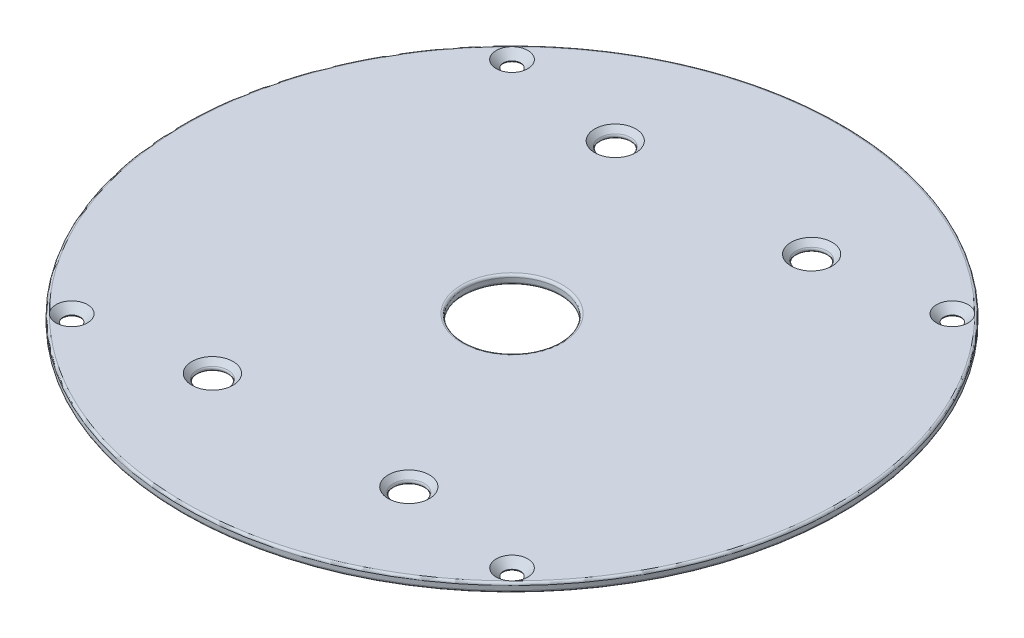
ISO-10303-21;
HEADER;
FILE_DESCRIPTION(('STEP AP214'),'2;1');
FILE_NAME('part.step','',(''),(''),'','','');
FILE_SCHEMA(('AUTOMOTIVE_DESIGN { 1 0 10303 214 1 1 1 1 }'));
ENDSEC;
DATA;
#1=APPLICATION_CONTEXT('core data for automotive mechanical design processes');
#2=APPLICATION_PROTOCOL_DEFINITION('international standard','automotive_design',2000,#1);
#3=PRODUCT_CONTEXT('',#1,'mechanical');
#4=PRODUCT('Part','Part','',(#3));
#5=PRODUCT_RELATED_PRODUCT_CATEGORY('part','',(#4));
#6=PRODUCT_DEFINITION_FORMATION('','',#4);
#7=PRODUCT_DEFINITION_CONTEXT('part definition',#1,'design');
#8=PRODUCT_DEFINITION('design','',#6,#7);
#9=PRODUCT_DEFINITION_SHAPE('','',#8);
#10=(LENGTH_UNIT() NAMED_UNIT(*) SI_UNIT(.MILLI.,.METRE.));
#11=(NAMED_UNIT(*) PLANE_ANGLE_UNIT() SI_UNIT($,.RADIAN.));
#12=(NAMED_UNIT(*) SI_UNIT($,.STERADIAN.) SOLID_ANGLE_UNIT());
#13=UNCERTAINTY_MEASURE_WITH_UNIT(LENGTH_MEASURE(1.E-05),#10,'distance_accuracy_value','');
#14=(GEOMETRIC_REPRESENTATION_CONTEXT(3) GLOBAL_UNCERTAINTY_ASSIGNED_CONTEXT((#13)) GLOBAL_UNIT_ASSIGNED_CONTEXT((#10,
#11,#12)) REPRESENTATION_CONTEXT('',''));
#15=CARTESIAN_POINT('',(0.,0.,0.));
#16=DIRECTION('',(0.,0.,1.));
#17=DIRECTION('',(1.,0.,0.));
#18=AXIS2_PLACEMENT_3D('',#15,#16,#17);
#19=CARTESIAN_POINT('',(0.,1.9,0.));
#20=DIRECTION('',(0.,-1.,0.));
#21=DIRECTION('',(0.,0.,-1.));
#22=AXIS2_PLACEMENT_3D('',#19,#20,#21);
#23=CYLINDRICAL_SURFACE('',#22,10.);
#24=CARTESIAN_POINT('',(0.,0.5,0.));
#25=DIRECTION('',(0.,1.,0.));
#26=DIRECTION('',(0.,0.,1.));
#27=AXIS2_PLACEMENT_3D('',#24,#25,#26);
#28=CIRCLE('',#27,10.);
#29=CARTESIAN_POINT('',(0.,0.5,-10.));
#30=VERTEX_POINT('',#29);
#31=EDGE_CURVE('E78',#30,#30,#28,.F.);
#32=CARTESIAN_POINT('',(0.,1.4,0.));
#33=DIRECTION('',(0.,1.,0.));
#34=DIRECTION('',(0.,0.,1.));
#35=AXIS2_PLACEMENT_3D('',#32,#33,#34);
#36=CIRCLE('',#35,10.);
#37=CARTESIAN_POINT('',(0.,1.4,-10.));
#38=VERTEX_POINT('',#37);
#39=EDGE_CURVE('E83',#38,#38,#36,.T.);
#40=CARTESIAN_POINT('',(0.,0.5,-10.));
#41=CARTESIAN_POINT('',(0.,0.509375,-10.));
#42=CARTESIAN_POINT('',(0.,0.51875,-10.));
#43=CARTESIAN_POINT('',(0.,0.5375,-10.));
#44=CARTESIAN_POINT('',(0.,0.546875,-10.));
#45=CARTESIAN_POINT('',(0.,0.565625,-10.));
#46=CARTESIAN_POINT('',(0.,0.575,-10.));
#47=CARTESIAN_POINT('',(0.,0.59375,-10.));
#48=CARTESIAN_POINT('',(0.,0.603125,-10.));
#49=CARTESIAN_POINT('',(0.,0.621875,-10.));
#50=CARTESIAN_POINT('',(0.,0.63125,-10.));
#51=CARTESIAN_POINT('',(0.,0.65,-10.));
#52=CARTESIAN_POINT('',(0.,0.659375,-10.));
#53=CARTESIAN_POINT('',(0.,0.678125,-10.));
#54=CARTESIAN_POINT('',(0.,0.6875,-10.));
#55=CARTESIAN_POINT('',(0.,0.70625,-10.));
#56=CARTESIAN_POINT('',(0.,0.715625,-10.));
#57=CARTESIAN_POINT('',(0.,0.734375,-10.));
#58=CARTESIAN_POINT('',(0.,0.74375,-10.));
#59=CARTESIAN_POINT('',(0.,0.7625,-10.));
#60=CARTESIAN_POINT('',(0.,0.771875,-10.));
#61=CARTESIAN_POINT('',(0.,0.790625,-10.));
#62=CARTESIAN_POINT('',(0.,0.8,-10.));
#63=CARTESIAN_POINT('',(0.,0.81875,-10.));
#64=CARTESIAN_POINT('',(0.,0.828125,-10.));
#65=CARTESIAN_POINT('',(0.,0.846875,-10.));
#66=CARTESIAN_POINT('',(0.,0.85625,-10.));
#67=CARTESIAN_POINT('',(0.,0.875,-10.));
#68=CARTESIAN_POINT('',(0.,0.884375,-10.));
#69=CARTESIAN_POINT('',(0.,0.903125,-10.));
#70=CARTESIAN_POINT('',(0.,0.9125,-10.));
#71=CARTESIAN_POINT('',(0.,0.93125,-10.));
#72=CARTESIAN_POINT('',(0.,0.940625,-10.));
#73=CARTESIAN_POINT('',(0.,0.959375,-10.));
#74=CARTESIAN_POINT('',(0.,0.96875,-10.));
#75=CARTESIAN_POINT('',(0.,0.9875,-10.));
#76=CARTESIAN_POINT('',(0.,0.996875,-10.));
#77=CARTESIAN_POINT('',(0.,1.015625,-10.));
#78=CARTESIAN_POINT('',(0.,1.025,-10.));
#79=CARTESIAN_POINT('',(0.,1.04375,-10.));
#80=CARTESIAN_POINT('',(0.,1.053125,-10.));
#81=CARTESIAN_POINT('',(0.,1.071875,-10.));
#82=CARTESIAN_POINT('',(0.,1.08125,-10.));
#83=CARTESIAN_POINT('',(0.,1.1,-10.));
#84=CARTESIAN_POINT('',(0.,1.109375,-10.));
#85=CARTESIAN_POINT('',(0.,1.128125,-10.));
#86=CARTESIAN_POINT('',(0.,1.1375,-10.));
#87=CARTESIAN_POINT('',(0.,1.15625,-10.));
#88=CARTESIAN_POINT('',(0.,1.165625,-10.));
#89=CARTESIAN_POINT('',(0.,1.184375,-10.));
#90=CARTESIAN_POINT('',(0.,1.19375,-10.));
#91=CARTESIAN_POINT('',(0.,1.2125,-10.));
#92=CARTESIAN_POINT('',(0.,1.221875,-10.));
#93=CARTESIAN_POINT('',(0.,1.240625,-10.));
#94=CARTESIAN_POINT('',(0.,1.25,-10.));
#95=CARTESIAN_POINT('',(0.,1.26875,-10.));
#96=CARTESIAN_POINT('',(0.,1.278125,-10.));
#97=CARTESIAN_POINT('',(0.,1.296875,-10.));
#98=CARTESIAN_POINT('',(0.,1.30625,-10.));
#99=CARTESIAN_POINT('',(0.,1.325,-10.));
#100=CARTESIAN_POINT('',(0.,1.334375,-10.));
#101=CARTESIAN_POINT('',(0.,1.353125,-10.));
#102=CARTESIAN_POINT('',(0.,1.3625,-10.));
#103=CARTESIAN_POINT('',(0.,1.38125,-10.));
#104=CARTESIAN_POINT('',(0.,1.390625,-10.));
#105=CARTESIAN_POINT('',(0.,1.4,-10.));
#106=B_SPLINE_CURVE_WITH_KNOTS('',3,(#40,#41,#42,#43,#44,#45,#46,#47,#48,#49,#50,#51,#52,#53,
#54,#55,#56,#57,#58,#59,#60,#61,#62,#63,#64,#65,#66,#67,#68,#69,#70,#71,#72,#73,#74,#75,#76,#77,
#78,#79,#80,#81,#82,#83,#84,#85,#86,#87,#88,#89,#90,#91,#92,#93,#94,#95,#96,#97,#98,#99,#100,
#101,#102,#103,#104,#105),.UNSPECIFIED.,.F.,.F.,(4,2,2,2,2,2,2,2,2,2,2,2,2,2,2,2,2,2,2,2,2,2,2,
2,2,2,2,2,2,2,2,2,4),(0.,0.0281249999999999,0.0562500000000001,0.084375,0.1125,0.140625,0.16875,
0.196875,0.225,0.253125,0.28125,0.309375,0.3375,0.365625,0.39375,0.421875,0.45,0.478125,0.50625,
0.534375,0.5625,0.590625,0.61875,0.646875,0.675,0.703125,0.73125,0.759375,0.7875,0.815625,
0.84375,0.871875,0.9),.UNSPECIFIED.);
#107=EDGE_CURVE('BSEAM43',#30,#38,#106,.T.);
#108=ORIENTED_EDGE('',*,*,#31,.T.);
#109=ORIENTED_EDGE('',*,*,#39,.T.);
#110=ORIENTED_EDGE('',*,*,#107,.T.);
#111=ORIENTED_EDGE('',*,*,#107,.F.);
#112=EDGE_LOOP('',(#108,#110,#109,#111));
#113=FACE_BOUND('',#112,.T.);
#114=ADVANCED_FACE('F43',(#113),#23,.F.);
#115=CARTESIAN_POINT('',(0.,1.9,0.));
#116=DIRECTION('',(0.,-1.,0.));
#117=DIRECTION('',(0.,0.,-1.));
#118=AXIS2_PLACEMENT_3D('',#115,#116,#117);
#119=CYLINDRICAL_SURFACE('',#118,68.8);
#120=CARTESIAN_POINT('',(0.,0.5,0.));
#121=DIRECTION('',(0.,1.,0.));
#122=DIRECTION('',(0.,0.,1.));
#123=AXIS2_PLACEMENT_3D('',#120,#121,#122);
#124=CIRCLE('',#123,68.8);
#125=CARTESIAN_POINT('',(0.,0.5,-68.8));
#126=VERTEX_POINT('',#125);
#127=EDGE_CURVE('E11',#126,#126,#124,.T.);
#128=CARTESIAN_POINT('',(0.,1.4,0.));
#129=DIRECTION('',(0.,1.,0.));
#130=DIRECTION('',(0.,0.,1.));
#131=AXIS2_PLACEMENT_3D('',#128,#129,#130);
#132=CIRCLE('',#131,68.8);
#133=CARTESIAN_POINT('',(0.,1.4,-68.8));
#134=VERTEX_POINT('',#133);
#135=EDGE_CURVE('E51',#134,#134,#132,.F.);
#136=CARTESIAN_POINT('',(0.,0.5,-68.8));
#137=CARTESIAN_POINT('',(0.,0.509375,-68.8));
#138=CARTESIAN_POINT('',(0.,0.51875,-68.8));
#139=CARTESIAN_POINT('',(0.,0.5375,-68.8));
#140=CARTESIAN_POINT('',(0.,0.546875,-68.8));
#141=CARTESIAN_POINT('',(0.,0.565625,-68.8));
#142=CARTESIAN_POINT('',(0.,0.575,-68.8));
#143=CARTESIAN_POINT('',(0.,0.59375,-68.8));
#144=CARTESIAN_POINT('',(0.,0.603125,-68.8));
#145=CARTESIAN_POINT('',(0.,0.621875,-68.8));
#146=CARTESIAN_POINT('',(0.,0.63125,-68.8));
#147=CARTESIAN_POINT('',(0.,0.65,-68.8));
#148=CARTESIAN_POINT('',(0.,0.659375,-68.8));
#149=CARTESIAN_POINT('',(0.,0.678125,-68.8));
#150=CARTESIAN_POINT('',(0.,0.6875,-68.8));
#151=CARTESIAN_POINT('',(0.,0.70625,-68.8));
#152=CARTESIAN_POINT('',(0.,0.715625,-68.8));
#153=CARTESIAN_POINT('',(0.,0.734375,-68.8));
#154=CARTESIAN_POINT('',(0.,0.74375,-68.8));
#155=CARTESIAN_POINT('',(0.,0.7625,-68.8));
#156=CARTESIAN_POINT('',(0.,0.771875,-68.8));
#157=CARTESIAN_POINT('',(0.,0.790625,-68.8));
#158=CARTESIAN_POINT('',(0.,0.8,-68.8));
#159=CARTESIAN_POINT('',(0.,0.81875,-68.8));
#160=CARTESIAN_POINT('',(0.,0.828125,-68.8));
#161=CARTESIAN_POINT('',(0.,0.846875,-68.8));
#162=CARTESIAN_POINT('',(0.,0.85625,-68.8));
#163=CARTESIAN_POINT('',(0.,0.875,-68.8));
#164=CARTESIAN_POINT('',(0.,0.884375,-68.8));
#165=CARTESIAN_POINT('',(0.,0.903125,-68.8));
#166=CARTESIAN_POINT('',(0.,0.9125,-68.8));
#167=CARTESIAN_POINT('',(0.,0.93125,-68.8));
#168=CARTESIAN_POINT('',(0.,0.940625,-68.8));
#169=CARTESIAN_POINT('',(0.,0.959375,-68.8));
#170=CARTESIAN_POINT('',(0.,0.96875,-68.8));
#171=CARTESIAN_POINT('',(0.,0.9875,-68.8));
#172=CARTESIAN_POINT('',(0.,0.996875,-68.8));
#173=CARTESIAN_POINT('',(0.,1.015625,-68.8));
#174=CARTESIAN_POINT('',(0.,1.025,-68.8));
#175=CARTESIAN_POINT('',(0.,1.04375,-68.8));
#176=CARTESIAN_POINT('',(0.,1.053125,-68.8));
#177=CARTESIAN_POINT('',(0.,1.071875,-68.8));
#178=CARTESIAN_POINT('',(0.,1.08125,-68.8));
#179=CARTESIAN_POINT('',(0.,1.1,-68.8));
#180=CARTESIAN_POINT('',(0.,1.109375,-68.8));
#181=CARTESIAN_POINT('',(0.,1.128125,-68.8));
#182=CARTESIAN_POINT('',(0.,1.1375,-68.8));
#183=CARTESIAN_POINT('',(0.,1.15625,-68.8));
#184=CARTESIAN_POINT('',(0.,1.165625,-68.8));
#185=CARTESIAN_POINT('',(0.,1.184375,-68.8));
#186=CARTESIAN_POINT('',(0.,1.19375,-68.8));
#187=CARTESIAN_POINT('',(0.,1.2125,-68.8));
#188=CARTESIAN_POINT('',(0.,1.221875,-68.8));
#189=CARTESIAN_POINT('',(0.,1.240625,-68.8));
#190=CARTESIAN_POINT('',(0.,1.25,-68.8));
#191=CARTESIAN_POINT('',(0.,1.26875,-68.8));
#192=CARTESIAN_POINT('',(0.,1.278125,-68.8));
#193=CARTESIAN_POINT('',(0.,1.296875,-68.8));
#194=CARTESIAN_POINT('',(0.,1.30625,-68.8));
#195=CARTESIAN_POINT('',(0.,1.325,-68.8));
#196=CARTESIAN_POINT('',(0.,1.334375,-68.8));
#197=CARTESIAN_POINT('',(0.,1.353125,-68.8));
#198=CARTESIAN_POINT('',(0.,1.3625,-68.8));
#199=CARTESIAN_POINT('',(0.,1.38125,-68.8));
#200=CARTESIAN_POINT('',(0.,1.390625,-68.8));
#201=CARTESIAN_POINT('',(0.,1.4,-68.8));
#202=B_SPLINE_CURVE_WITH_KNOTS('',3,(#136,#137,#138,#139,#140,#141,#142,#143,#144,#145,#146,
#147,#148,#149,#150,#151,#152,#153,#154,#155,#156,#157,#158,#159,#160,#161,#162,#163,#164,#165,
#166,#167,#168,#169,#170,#171,#172,#173,#174,#175,#176,#177,#178,#179,#180,#181,#182,#183,#184,
#185,#186,#187,#188,#189,#190,#191,#192,#193,#194,#195,#196,#197,#198,#199,#200,#201),
.UNSPECIFIED.,.F.,.F.,(4,2,2,2,2,2,2,2,2,2,2,2,2,2,2,2,2,2,2,2,2,2,2,2,2,2,2,2,2,2,2,2,4),(0.,
0.0281249999999999,0.0562500000000001,0.084375,0.1125,0.140625,0.16875,0.196875,0.225,0.253125,
0.28125,0.309375,0.3375,0.365625,0.39375,0.421875,0.45,0.478125,0.50625,0.534375,0.5625,
0.590625,0.61875,0.646875,0.675,0.703125,0.73125,0.759375,0.7875,0.815625,0.84375,0.871875,0.9),.UNSPECIFIED.);
#203=EDGE_CURVE('BSEAM98',#126,#134,#202,.T.);
#204=ORIENTED_EDGE('',*,*,#127,.T.);
#205=ORIENTED_EDGE('',*,*,#135,.T.);
#206=ORIENTED_EDGE('',*,*,#203,.T.);
#207=ORIENTED_EDGE('',*,*,#203,.F.);
#208=EDGE_LOOP('',(#204,#206,#205,#207));
#209=FACE_BOUND('',#208,.T.);
#210=ADVANCED_FACE('F98',(#209),#119,.T.);
#211=CARTESIAN_POINT('',(0.,1.9,0.));
#212=DIRECTION('',(0.,1.,0.));
#213=DIRECTION('',(0.,0.,1.));
#214=AXIS2_PLACEMENT_3D('',#211,#212,#213);
#215=PLANE('',#214);
#216=CARTESIAN_POINT('',(0.,1.9,0.));
#217=DIRECTION('',(0.,1.,0.));
#218=DIRECTION('',(0.,0.,1.));
#219=AXIS2_PLACEMENT_3D('',#216,#217,#218);
#220=CIRCLE('',#219,10.5);
#221=CARTESIAN_POINT('',(0.,1.9,10.5));
#222=VERTEX_POINT('',#221);
#223=EDGE_CURVE('E92',#222,#222,#220,.F.);
#224=ORIENTED_EDGE('',*,*,#223,.T.);
#225=EDGE_LOOP('',(#224));
#226=FACE_BOUND('',#225,.T.);
#227=CARTESIAN_POINT('',(45.9619407771258,1.9,45.9619407771253));
#228=DIRECTION('',(0.,1.,0.));
#229=DIRECTION('',(0.,0.,1.));
#230=AXIS2_PLACEMENT_3D('',#227,#228,#229);
#231=CIRCLE('',#230,3.30000000000008);
#232=CARTESIAN_POINT('',(48.2953931550415,1.9,48.295393155041));
#233=VERTEX_POINT('',#232);
#234=EDGE_CURVE('E77',#233,#233,#231,.F.);
#235=ORIENTED_EDGE('',*,*,#234,.T.);
#236=CARTESIAN_POINT('',(0.,1.9,0.));
#237=DIRECTION('',(0.,1.,0.));
#238=DIRECTION('',(0.,0.,1.));
#239=AXIS2_PLACEMENT_3D('',#236,#237,#238);
#240=CIRCLE('',#239,68.3);
#241=CARTESIAN_POINT('',(48.295393155041,1.9,-48.2953931550415));
#242=VERTEX_POINT('',#241);
#243=EDGE_CURVE('E89',#233,#242,#240,.T.);
#244=ORIENTED_EDGE('',*,*,#243,.T.);
#245=CARTESIAN_POINT('',(45.9619407771253,1.9,-45.9619407771258));
#246=DIRECTION('',(0.,1.,0.));
#247=DIRECTION('',(0.,0.,1.));
#248=AXIS2_PLACEMENT_3D('',#245,#246,#247);
#249=CIRCLE('',#248,3.30000000000008);
#250=EDGE_CURVE('E271',#242,#242,#249,.F.);
#251=ORIENTED_EDGE('',*,*,#250,.T.);
#252=CARTESIAN_POINT('',(0.,1.9,0.));
#253=DIRECTION('',(0.,1.,0.));
#254=DIRECTION('',(0.,0.,1.));
#255=AXIS2_PLACEMENT_3D('',#252,#253,#254);
#256=CIRCLE('',#255,68.3);
#257=CARTESIAN_POINT('',(-48.2953931550415,1.9,-48.295393155041));
#258=VERTEX_POINT('',#257);
#259=EDGE_CURVE('E59',#242,#258,#256,.T.);
#260=ORIENTED_EDGE('',*,*,#259,.T.);
#261=CARTESIAN_POINT('',(-45.9619407771258,1.9,-45.9619407771253));
#262=DIRECTION('',(0.,1.,0.));
#263=DIRECTION('',(0.,0.,1.));
#264=AXIS2_PLACEMENT_3D('',#261,#262,#263);
#265=CIRCLE('',#264,3.30000000000008);
#266=EDGE_CURVE('E272',#258,#258,#265,.F.);
#267=ORIENTED_EDGE('',*,*,#266,.T.);
#268=CARTESIAN_POINT('',(0.,1.9,0.));
#269=DIRECTION('',(0.,1.,0.));
#270=DIRECTION('',(0.,0.,1.));
#271=AXIS2_PLACEMENT_3D('',#268,#269,#270);
#272=CIRCLE('',#271,68.3);
#273=CARTESIAN_POINT('',(-48.295393155041,1.9,48.2953931550415));
#274=VERTEX_POINT('',#273);
#275=EDGE_CURVE('E79',#258,#274,#272,.T.);
#276=ORIENTED_EDGE('',*,*,#275,.T.);
#277=CARTESIAN_POINT('',(-45.9619407771254,1.9,45.9619407771258));
#278=DIRECTION('',(0.,1.,0.));
#279=DIRECTION('',(0.,0.,1.));
#280=AXIS2_PLACEMENT_3D('',#277,#278,#279);
#281=CIRCLE('',#280,3.30000000000008);
#282=EDGE_CURVE('E76',#274,#274,#281,.F.);
#283=ORIENTED_EDGE('',*,*,#282,.T.);
#284=CARTESIAN_POINT('',(0.,1.9,0.));
#285=DIRECTION('',(0.,1.,0.));
#286=DIRECTION('',(0.,0.,1.));
#287=AXIS2_PLACEMENT_3D('',#284,#285,#286);
#288=CIRCLE('',#287,68.3);
#289=EDGE_CURVE('E75',#274,#233,#288,.T.);
#290=ORIENTED_EDGE('',*,*,#289,.T.);
#291=EDGE_LOOP('',(#235,#244,#251,#260,#267,#276,#283,#290));
#292=FACE_BOUND('',#291,.T.);
#293=CARTESIAN_POINT('',(-20.5,1.9,-42.05));
#294=DIRECTION('',(0.,1.,0.));
#295=DIRECTION('',(0.,0.,1.));
#296=AXIS2_PLACEMENT_3D('',#293,#294,#295);
#297=CIRCLE('',#296,4.30000000000002);
#298=CARTESIAN_POINT('',(-20.5,1.9,-37.75));
#299=VERTEX_POINT('',#298);
#300=EDGE_CURVE('E277',#299,#299,#297,.F.);
#301=ORIENTED_EDGE('',*,*,#300,.T.);
#302=EDGE_LOOP('',(#301));
#303=FACE_BOUND('',#302,.T.);
#304=CARTESIAN_POINT('',(20.5,1.9,-42.05));
#305=DIRECTION('',(0.,1.,0.));
#306=DIRECTION('',(0.,0.,1.));
#307=AXIS2_PLACEMENT_3D('',#304,#305,#306);
#308=CIRCLE('',#307,4.30000000000002);
#309=CARTESIAN_POINT('',(20.5,1.9,-37.75));
#310=VERTEX_POINT('',#309);
#311=EDGE_CURVE('E282',#310,#310,#308,.F.);
#312=ORIENTED_EDGE('',*,*,#311,.T.);
#313=EDGE_LOOP('',(#312));
#314=FACE_BOUND('',#313,.T.);
#315=CARTESIAN_POINT('',(20.5,1.9,42.05));
#316=DIRECTION('',(0.,1.,0.));
#317=DIRECTION('',(0.,0.,1.));
#318=AXIS2_PLACEMENT_3D('',#315,#316,#317);
#319=CIRCLE('',#318,4.30000000000002);
#320=CARTESIAN_POINT('',(20.5,1.9,46.35));
#321=VERTEX_POINT('',#320);
#322=EDGE_CURVE('E284',#321,#321,#319,.F.);
#323=ORIENTED_EDGE('',*,*,#322,.T.);
#324=EDGE_LOOP('',(#323));
#325=FACE_BOUND('',#324,.T.);
#326=CARTESIAN_POINT('',(-20.5,1.9,42.05));
#327=DIRECTION('',(0.,1.,0.));
#328=DIRECTION('',(0.,0.,1.));
#329=AXIS2_PLACEMENT_3D('',#326,#327,#328);
#330=CIRCLE('',#329,4.30000000000002);
#331=CARTESIAN_POINT('',(-20.5,1.9,46.35));
#332=VERTEX_POINT('',#331);
#333=EDGE_CURVE('E290',#332,#332,#330,.F.);
#334=ORIENTED_EDGE('',*,*,#333,.T.);
#335=EDGE_LOOP('',(#334));
#336=FACE_BOUND('',#335,.T.);
#337=ADVANCED_FACE('F74',(#226,#292,#303,#314,#325,#336),#215,.T.);
#338=CARTESIAN_POINT('',(0.,0.,0.));
#339=DIRECTION('',(0.,1.,0.));
#340=DIRECTION('',(0.,0.,1.));
#341=AXIS2_PLACEMENT_3D('',#338,#339,#340);
#342=PLANE('',#341);
#343=CARTESIAN_POINT('',(-45.9619407771258,0.,-45.9619407771253));
#344=DIRECTION('',(0.,1.,0.));
#345=DIRECTION('',(0.,0.,1.));
#346=AXIS2_PLACEMENT_3D('',#343,#344,#345);
#347=CIRCLE('',#346,2.28989794855662);
#348=CARTESIAN_POINT('',(-45.9619407771258,0.,-43.6720428285687));
#349=VERTEX_POINT('',#348);
#350=EDGE_CURVE('E229',#349,#349,#347,.T.);
#351=ORIENTED_EDGE('',*,*,#350,.T.);
#352=EDGE_LOOP('',(#351));
#353=FACE_BOUND('',#352,.T.);
#354=CARTESIAN_POINT('',(45.9619407771253,0.,-45.9619407771258));
#355=DIRECTION('',(0.,1.,0.));
#356=DIRECTION('',(0.,0.,1.));
#357=AXIS2_PLACEMENT_3D('',#354,#355,#356);
#358=CIRCLE('',#357,2.2898979485566);
#359=CARTESIAN_POINT('',(45.9619407771253,0.,-43.6720428285692));
#360=VERTEX_POINT('',#359);
#361=EDGE_CURVE('E231',#360,#360,#358,.T.);
#362=ORIENTED_EDGE('',*,*,#361,.T.);
#363=EDGE_LOOP('',(#362));
#364=FACE_BOUND('',#363,.T.);
#365=CARTESIAN_POINT('',(45.9619407771258,0.,45.9619407771253));
#366=DIRECTION('',(0.,1.,0.));
#367=DIRECTION('',(0.,0.,1.));
#368=AXIS2_PLACEMENT_3D('',#365,#366,#367);
#369=CIRCLE('',#368,2.28989794855662);
#370=CARTESIAN_POINT('',(45.9619407771258,0.,48.251838725682));
#371=VERTEX_POINT('',#370);
#372=EDGE_CURVE('E236',#371,#371,#369,.T.);
#373=ORIENTED_EDGE('',*,*,#372,.T.);
#374=EDGE_LOOP('',(#373));
#375=FACE_BOUND('',#374,.T.);
#376=CARTESIAN_POINT('',(-45.9619407771254,0.,45.9619407771258));
#377=DIRECTION('',(0.,1.,0.));
#378=DIRECTION('',(0.,0.,1.));
#379=AXIS2_PLACEMENT_3D('',#376,#377,#378);
#380=CIRCLE('',#379,2.28989794855662);
#381=CARTESIAN_POINT('',(-45.9619407771254,0.,48.2518387256824));
#382=VERTEX_POINT('',#381);
#383=EDGE_CURVE('E237',#382,#382,#380,.T.);
#384=ORIENTED_EDGE('',*,*,#383,.T.);
#385=EDGE_LOOP('',(#384));
#386=FACE_BOUND('',#385,.T.);
#387=CARTESIAN_POINT('',(-20.5,0.,42.05));
#388=DIRECTION('',(0.,1.,0.));
#389=DIRECTION('',(0.,0.,1.));
#390=AXIS2_PLACEMENT_3D('',#387,#388,#389);
#391=CIRCLE('',#390,3.60710678118658);
#392=CARTESIAN_POINT('',(-20.5,0.,45.6571067811866));
#393=VERTEX_POINT('',#392);
#394=EDGE_CURVE('E245',#393,#393,#391,.T.);
#395=ORIENTED_EDGE('',*,*,#394,.T.);
#396=EDGE_LOOP('',(#395));
#397=FACE_BOUND('',#396,.T.);
#398=CARTESIAN_POINT('',(20.5,0.,42.05));
#399=DIRECTION('',(0.,1.,0.));
#400=DIRECTION('',(0.,0.,1.));
#401=AXIS2_PLACEMENT_3D('',#398,#399,#400);
#402=CIRCLE('',#401,3.60710678118658);
#403=CARTESIAN_POINT('',(20.5,0.,45.6571067811866));
#404=VERTEX_POINT('',#403);
#405=EDGE_CURVE('E244',#404,#404,#402,.T.);
#406=ORIENTED_EDGE('',*,*,#405,.T.);
#407=EDGE_LOOP('',(#406));
#408=FACE_BOUND('',#407,.T.);
#409=CARTESIAN_POINT('',(20.5,0.,-42.05));
#410=DIRECTION('',(0.,1.,0.));
#411=DIRECTION('',(0.,0.,1.));
#412=AXIS2_PLACEMENT_3D('',#409,#410,#411);
#413=CIRCLE('',#412,3.60710678118658);
#414=CARTESIAN_POINT('',(20.5,0.,-38.4428932188134));
#415=VERTEX_POINT('',#414);
#416=EDGE_CURVE('E247',#415,#415,#413,.T.);
#417=ORIENTED_EDGE('',*,*,#416,.T.);
#418=EDGE_LOOP('',(#417));
#419=FACE_BOUND('',#418,.T.);
#420=CARTESIAN_POINT('',(-20.5,0.,-42.05));
#421=DIRECTION('',(0.,1.,0.));
#422=DIRECTION('',(0.,0.,1.));
#423=AXIS2_PLACEMENT_3D('',#420,#421,#422);
#424=CIRCLE('',#423,3.60710678118658);
#425=CARTESIAN_POINT('',(-20.5,0.,-38.4428932188134));
#426=VERTEX_POINT('',#425);
#427=EDGE_CURVE('E252',#426,#426,#424,.T.);
#428=ORIENTED_EDGE('',*,*,#427,.T.);
#429=EDGE_LOOP('',(#428));
#430=FACE_BOUND('',#429,.T.);
#431=CARTESIAN_POINT('',(0.,0.,0.));
#432=DIRECTION('',(0.,1.,0.));
#433=DIRECTION('',(0.,0.,1.));
#434=AXIS2_PLACEMENT_3D('',#431,#432,#433);
#435=CIRCLE('',#434,10.5);
#436=CARTESIAN_POINT('',(0.,0.,10.5));
#437=VERTEX_POINT('',#436);
#438=EDGE_CURVE('E251',#437,#437,#435,.T.);
#439=ORIENTED_EDGE('',*,*,#438,.T.);
#440=EDGE_LOOP('',(#439));
#441=FACE_BOUND('',#440,.T.);
#442=CARTESIAN_POINT('',(0.,0.,0.));
#443=DIRECTION('',(0.,1.,0.));
#444=DIRECTION('',(0.,0.,1.));
#445=AXIS2_PLACEMENT_3D('',#442,#443,#444);
#446=CIRCLE('',#445,68.3);
#447=CARTESIAN_POINT('',(0.,0.,68.3));
#448=VERTEX_POINT('',#447);
#449=EDGE_CURVE('E260',#448,#448,#446,.F.);
#450=ORIENTED_EDGE('',*,*,#449,.T.);
#451=EDGE_LOOP('',(#450));
#452=FACE_BOUND('',#451,.T.);
#453=ADVANCED_FACE('F121',(#353,#364,#375,#386,#397,#408,#419,#430,#441,#452),#342,.F.);
#454=CARTESIAN_POINT('',(-20.5,-0.100000000000035,-42.05));
#455=DIRECTION('',(0.,1.,0.));
#456=DIRECTION('',(0.,0.,1.));
#457=AXIS2_PLACEMENT_3D('',#454,#455,#456);
#458=CONICAL_SURFACE('',#457,2.3,0.785398163397444);
#459=CARTESIAN_POINT('',(-20.5,0.853553390593272,-42.05));
#460=DIRECTION('',(0.,1.,0.));
#461=DIRECTION('',(0.,0.,1.));
#462=AXIS2_PLACEMENT_3D('',#459,#460,#461);
#463=CIRCLE('',#462,3.2535533905933);
#464=CARTESIAN_POINT('',(-20.5,0.853553390593272,-38.7964466094067));
#465=VERTEX_POINT('',#464);
#466=EDGE_CURVE('E220',#465,#465,#463,.F.);
#467=ORIENTED_EDGE('',*,*,#466,.T.);
#468=EDGE_LOOP('',(#467));
#469=FACE_BOUND('',#468,.T.);
#470=ORIENTED_EDGE('',*,*,#300,.F.);
#471=EDGE_LOOP('',(#470));
#472=FACE_BOUND('',#471,.T.);
#473=ADVANCED_FACE('F120',(#469,#472),#458,.F.);
#474=CARTESIAN_POINT('',(20.5,-0.100000000000035,-42.05));
#475=DIRECTION('',(0.,1.,0.));
#476=DIRECTION('',(0.,0.,1.));
#477=AXIS2_PLACEMENT_3D('',#474,#475,#476);
#478=CONICAL_SURFACE('',#477,2.3,0.785398163397444);
#479=CARTESIAN_POINT('',(20.5,0.853553390593272,-42.05));
#480=DIRECTION('',(0.,1.,0.));
#481=DIRECTION('',(0.,0.,1.));
#482=AXIS2_PLACEMENT_3D('',#479,#480,#481);
#483=CIRCLE('',#482,3.2535533905933);
#484=CARTESIAN_POINT('',(20.5,0.853553390593272,-38.7964466094067));
#485=VERTEX_POINT('',#484);
#486=EDGE_CURVE('E219',#485,#485,#483,.F.);
#487=ORIENTED_EDGE('',*,*,#486,.T.);
#488=EDGE_LOOP('',(#487));
#489=FACE_BOUND('',#488,.T.);
#490=ORIENTED_EDGE('',*,*,#311,.F.);
#491=EDGE_LOOP('',(#490));
#492=FACE_BOUND('',#491,.T.);
#493=ADVANCED_FACE('F124',(#489,#492),#478,.F.);
#494=CARTESIAN_POINT('',(20.5,-0.100000000000035,42.05));
#495=DIRECTION('',(0.,1.,0.));
#496=DIRECTION('',(0.,0.,1.));
#497=AXIS2_PLACEMENT_3D('',#494,#495,#496);
#498=CONICAL_SURFACE('',#497,2.3,0.785398163397444);
#499=CARTESIAN_POINT('',(20.5,0.853553390593272,42.05));
#500=DIRECTION('',(0.,1.,0.));
#501=DIRECTION('',(0.,0.,1.));
#502=AXIS2_PLACEMENT_3D('',#499,#500,#501);
#503=CIRCLE('',#502,3.2535533905933);
#504=CARTESIAN_POINT('',(20.5,0.853553390593272,45.3035533905933));
#505=VERTEX_POINT('',#504);
#506=EDGE_CURVE('E221',#505,#505,#503,.F.);
#507=ORIENTED_EDGE('',*,*,#506,.T.);
#508=EDGE_LOOP('',(#507));
#509=FACE_BOUND('',#508,.T.);
#510=ORIENTED_EDGE('',*,*,#322,.F.);
#511=EDGE_LOOP('',(#510));
#512=FACE_BOUND('',#511,.T.);
#513=ADVANCED_FACE('F132',(#509,#512),#498,.F.);
#514=CARTESIAN_POINT('',(-20.5,-0.100000000000035,42.05));
#515=DIRECTION('',(0.,1.,0.));
#516=DIRECTION('',(0.,0.,1.));
#517=AXIS2_PLACEMENT_3D('',#514,#515,#516);
#518=CONICAL_SURFACE('',#517,2.3,0.785398163397444);
#519=CARTESIAN_POINT('',(-20.5,0.853553390593272,42.05));
#520=DIRECTION('',(0.,1.,0.));
#521=DIRECTION('',(0.,0.,1.));
#522=AXIS2_PLACEMENT_3D('',#519,#520,#521);
#523=CIRCLE('',#522,3.2535533905933);
#524=CARTESIAN_POINT('',(-20.5,0.853553390593272,45.3035533905933));
#525=VERTEX_POINT('',#524);
#526=EDGE_CURVE('E227',#525,#525,#523,.F.);
#527=ORIENTED_EDGE('',*,*,#526,.T.);
#528=EDGE_LOOP('',(#527));
#529=FACE_BOUND('',#528,.T.);
#530=ORIENTED_EDGE('',*,*,#333,.F.);
#531=EDGE_LOOP('',(#530));
#532=FACE_BOUND('',#531,.T.);
#533=ADVANCED_FACE('F139',(#529,#532),#518,.F.);
#534=CARTESIAN_POINT('',(45.9619407771258,0.399999999999915,45.9619407771253));
#535=DIRECTION('',(0.,1.,0.));
#536=DIRECTION('',(0.,0.,1.));
#537=AXIS2_PLACEMENT_3D('',#534,#535,#536);
#538=CONICAL_SURFACE('',#537,1.8,0.785398163397446);
#539=ORIENTED_EDGE('',*,*,#234,.F.);
#540=EDGE_LOOP('',(#539));
#541=FACE_BOUND('',#540,.T.);
#542=CARTESIAN_POINT('',(45.9619407771258,0.399999999999915,45.9619407771253));
#543=DIRECTION('',(0.,1.,0.));
#544=DIRECTION('',(0.,0.,1.));
#545=AXIS2_PLACEMENT_3D('',#542,#543,#544);
#546=CIRCLE('',#545,1.8);
#547=CARTESIAN_POINT('',(45.9619407771258,0.399999999999915,47.7619407771253));
#548=VERTEX_POINT('',#547);
#549=EDGE_CURVE('E273',#548,#548,#546,.T.);
#550=ORIENTED_EDGE('',*,*,#549,.F.);
#551=EDGE_LOOP('',(#550));
#552=FACE_BOUND('',#551,.T.);
#553=ADVANCED_FACE('F143',(#541,#552),#538,.F.);
#554=CARTESIAN_POINT('',(-45.9619407771254,0.399999999999915,45.9619407771258));
#555=DIRECTION('',(0.,1.,0.));
#556=DIRECTION('',(0.,0.,1.));
#557=AXIS2_PLACEMENT_3D('',#554,#555,#556);
#558=CONICAL_SURFACE('',#557,1.8,0.785398163397446);
#559=ORIENTED_EDGE('',*,*,#282,.F.);
#560=EDGE_LOOP('',(#559));
#561=FACE_BOUND('',#560,.T.);
#562=CARTESIAN_POINT('',(-45.9619407771254,0.399999999999915,45.9619407771258));
#563=DIRECTION('',(0.,1.,0.));
#564=DIRECTION('',(0.,0.,1.));
#565=AXIS2_PLACEMENT_3D('',#562,#563,#564);
#566=CIRCLE('',#565,1.8);
#567=CARTESIAN_POINT('',(-45.9619407771254,0.399999999999915,47.7619407771258));
#568=VERTEX_POINT('',#567);
#569=EDGE_CURVE('E267',#568,#568,#566,.T.);
#570=ORIENTED_EDGE('',*,*,#569,.F.);
#571=EDGE_LOOP('',(#570));
#572=FACE_BOUND('',#571,.T.);
#573=ADVANCED_FACE('F155',(#561,#572),#558,.F.);
#574=CARTESIAN_POINT('',(-45.9619407771258,0.399999999999915,-45.9619407771253));
#575=DIRECTION('',(0.,1.,0.));
#576=DIRECTION('',(0.,0.,1.));
#577=AXIS2_PLACEMENT_3D('',#574,#575,#576);
#578=CONICAL_SURFACE('',#577,1.8,0.785398163397446);
#579=ORIENTED_EDGE('',*,*,#266,.F.);
#580=EDGE_LOOP('',(#579));
#581=FACE_BOUND('',#580,.T.);
#582=CARTESIAN_POINT('',(-45.9619407771258,0.399999999999915,-45.9619407771253));
#583=DIRECTION('',(0.,1.,0.));
#584=DIRECTION('',(0.,0.,1.));
#585=AXIS2_PLACEMENT_3D('',#582,#583,#584);
#586=CIRCLE('',#585,1.8);
#587=CARTESIAN_POINT('',(-45.9619407771258,0.399999999999915,-44.1619407771253));
#588=VERTEX_POINT('',#587);
#589=EDGE_CURVE('E263',#588,#588,#586,.T.);
#590=ORIENTED_EDGE('',*,*,#589,.F.);
#591=EDGE_LOOP('',(#590));
#592=FACE_BOUND('',#591,.T.);
#593=ADVANCED_FACE('F156',(#581,#592),#578,.F.);
#594=CARTESIAN_POINT('',(45.9619407771253,0.399999999999899,-45.9619407771258));
#595=DIRECTION('',(0.,1.,0.));
#596=DIRECTION('',(0.,0.,1.));
#597=AXIS2_PLACEMENT_3D('',#594,#595,#596);
#598=CONICAL_SURFACE('',#597,1.79999999999999,0.785398163397446);
#599=ORIENTED_EDGE('',*,*,#250,.F.);
#600=EDGE_LOOP('',(#599));
#601=FACE_BOUND('',#600,.T.);
#602=CARTESIAN_POINT('',(45.9619407771253,0.399999999999899,-45.9619407771258));
#603=DIRECTION('',(0.,1.,0.));
#604=DIRECTION('',(0.,0.,1.));
#605=AXIS2_PLACEMENT_3D('',#602,#603,#604);
#606=CIRCLE('',#605,1.79999999999999);
#607=CARTESIAN_POINT('',(45.9619407771253,0.399999999999899,-44.1619407771258));
#608=VERTEX_POINT('',#607);
#609=EDGE_CURVE('E259',#608,#608,#606,.T.);
#610=ORIENTED_EDGE('',*,*,#609,.F.);
#611=EDGE_LOOP('',(#610));
#612=FACE_BOUND('',#611,.T.);
#613=ADVANCED_FACE('F168',(#601,#612),#598,.F.);
#614=CARTESIAN_POINT('',(-45.9619407771258,0.5,-45.9619407771253));
#615=DIRECTION('',(0.,1.,0.));
#616=DIRECTION('',(0.,0.,1.));
#617=AXIS2_PLACEMENT_3D('',#614,#615,#616);
#618=TOROIDAL_SURFACE('',#617,2.28989794855662,0.5);
#619=ORIENTED_EDGE('',*,*,#589,.T.);
#620=EDGE_LOOP('',(#619));
#621=FACE_BOUND('',#620,.T.);
#622=ORIENTED_EDGE('',*,*,#350,.F.);
#623=EDGE_LOOP('',(#622));
#624=FACE_BOUND('',#623,.T.);
#625=ADVANCED_FACE('F175',(#621,#624),#618,.T.);
#626=CARTESIAN_POINT('',(45.9619407771253,0.5,-45.9619407771258));
#627=DIRECTION('',(0.,1.,0.));
#628=DIRECTION('',(0.,0.,1.));
#629=AXIS2_PLACEMENT_3D('',#626,#627,#628);
#630=TOROIDAL_SURFACE('',#629,2.2898979485566,0.5);
#631=ORIENTED_EDGE('',*,*,#609,.T.);
#632=EDGE_LOOP('',(#631));
#633=FACE_BOUND('',#632,.T.);
#634=ORIENTED_EDGE('',*,*,#361,.F.);
#635=EDGE_LOOP('',(#634));
#636=FACE_BOUND('',#635,.T.);
#637=ADVANCED_FACE('F176',(#633,#636),#630,.T.);
#638=CARTESIAN_POINT('',(45.9619407771258,0.5,45.9619407771253));
#639=DIRECTION('',(0.,1.,0.));
#640=DIRECTION('',(0.,0.,1.));
#641=AXIS2_PLACEMENT_3D('',#638,#639,#640);
#642=TOROIDAL_SURFACE('',#641,2.28989794855662,0.5);
#643=ORIENTED_EDGE('',*,*,#549,.T.);
#644=EDGE_LOOP('',(#643));
#645=FACE_BOUND('',#644,.T.);
#646=ORIENTED_EDGE('',*,*,#372,.F.);
#647=EDGE_LOOP('',(#646));
#648=FACE_BOUND('',#647,.T.);
#649=ADVANCED_FACE('F179',(#645,#648),#642,.T.);
#650=CARTESIAN_POINT('',(-45.9619407771254,0.5,45.9619407771258));
#651=DIRECTION('',(0.,1.,0.));
#652=DIRECTION('',(0.,0.,1.));
#653=AXIS2_PLACEMENT_3D('',#650,#651,#652);
#654=TOROIDAL_SURFACE('',#653,2.28989794855662,0.5);
#655=ORIENTED_EDGE('',*,*,#569,.T.);
#656=EDGE_LOOP('',(#655));
#657=FACE_BOUND('',#656,.T.);
#658=ORIENTED_EDGE('',*,*,#383,.F.);
#659=EDGE_LOOP('',(#658));
#660=FACE_BOUND('',#659,.T.);
#661=ADVANCED_FACE('F183',(#657,#660),#654,.T.);
#662=CARTESIAN_POINT('',(-20.5,0.5,42.05));
#663=DIRECTION('',(0.,1.,0.));
#664=DIRECTION('',(0.,0.,1.));
#665=AXIS2_PLACEMENT_3D('',#662,#663,#664);
#666=TOROIDAL_SURFACE('',#665,3.60710678118658,0.5);
#667=ORIENTED_EDGE('',*,*,#526,.F.);
#668=EDGE_LOOP('',(#667));
#669=FACE_BOUND('',#668,.T.);
#670=ORIENTED_EDGE('',*,*,#394,.F.);
#671=EDGE_LOOP('',(#670));
#672=FACE_BOUND('',#671,.T.);
#673=ADVANCED_FACE('F189',(#669,#672),#666,.T.);
#674=CARTESIAN_POINT('',(20.5,0.5,42.05));
#675=DIRECTION('',(0.,1.,0.));
#676=DIRECTION('',(0.,0.,1.));
#677=AXIS2_PLACEMENT_3D('',#674,#675,#676);
#678=TOROIDAL_SURFACE('',#677,3.60710678118658,0.5);
#679=ORIENTED_EDGE('',*,*,#506,.F.);
#680=EDGE_LOOP('',(#679));
#681=FACE_BOUND('',#680,.T.);
#682=ORIENTED_EDGE('',*,*,#405,.F.);
#683=EDGE_LOOP('',(#682));
#684=FACE_BOUND('',#683,.T.);
#685=ADVANCED_FACE('F195',(#681,#684),#678,.T.);
#686=CARTESIAN_POINT('',(20.5,0.5,-42.05));
#687=DIRECTION('',(0.,1.,0.));
#688=DIRECTION('',(0.,0.,1.));
#689=AXIS2_PLACEMENT_3D('',#686,#687,#688);
#690=TOROIDAL_SURFACE('',#689,3.60710678118658,0.5);
#691=ORIENTED_EDGE('',*,*,#486,.F.);
#692=EDGE_LOOP('',(#691));
#693=FACE_BOUND('',#692,.T.);
#694=ORIENTED_EDGE('',*,*,#416,.F.);
#695=EDGE_LOOP('',(#694));
#696=FACE_BOUND('',#695,.T.);
#697=ADVANCED_FACE('F197',(#693,#696),#690,.T.);
#698=CARTESIAN_POINT('',(-20.5,0.5,-42.05));
#699=DIRECTION('',(0.,1.,0.));
#700=DIRECTION('',(0.,0.,1.));
#701=AXIS2_PLACEMENT_3D('',#698,#699,#700);
#702=TOROIDAL_SURFACE('',#701,3.60710678118658,0.5);
#703=ORIENTED_EDGE('',*,*,#466,.F.);
#704=EDGE_LOOP('',(#703));
#705=FACE_BOUND('',#704,.T.);
#706=ORIENTED_EDGE('',*,*,#427,.F.);
#707=EDGE_LOOP('',(#706));
#708=FACE_BOUND('',#707,.T.);
#709=ADVANCED_FACE('F196',(#705,#708),#702,.T.);
#710=CARTESIAN_POINT('',(0.,0.5,0.));
#711=DIRECTION('',(0.,1.,0.));
#712=DIRECTION('',(0.,0.,1.));
#713=AXIS2_PLACEMENT_3D('',#710,#711,#712);
#714=TOROIDAL_SURFACE('',#713,10.5,0.5);
#715=ORIENTED_EDGE('',*,*,#31,.F.);
#716=EDGE_LOOP('',(#715));
#717=FACE_BOUND('',#716,.T.);
#718=ORIENTED_EDGE('',*,*,#438,.F.);
#719=EDGE_LOOP('',(#718));
#720=FACE_BOUND('',#719,.T.);
#721=ADVANCED_FACE('F201',(#717,#720),#714,.T.);
#722=CARTESIAN_POINT('',(0.,1.4,0.));
#723=DIRECTION('',(0.,1.,0.));
#724=DIRECTION('',(0.,0.,1.));
#725=AXIS2_PLACEMENT_3D('',#722,#723,#724);
#726=TOROIDAL_SURFACE('',#725,10.5,0.5);
#727=ORIENTED_EDGE('',*,*,#223,.F.);
#728=EDGE_LOOP('',(#727));
#729=FACE_BOUND('',#728,.T.);
#730=ORIENTED_EDGE('',*,*,#39,.F.);
#731=EDGE_LOOP('',(#730));
#732=FACE_BOUND('',#731,.T.);
#733=ADVANCED_FACE('F101',(#729,#732),#726,.T.);
#734=CARTESIAN_POINT('',(0.,0.5,0.));
#735=DIRECTION('',(0.,1.,0.));
#736=DIRECTION('',(0.,0.,1.));
#737=AXIS2_PLACEMENT_3D('',#734,#735,#736);
#738=TOROIDAL_SURFACE('',#737,68.3,0.5);
#739=ORIENTED_EDGE('',*,*,#449,.F.);
#740=EDGE_LOOP('',(#739));
#741=FACE_BOUND('',#740,.T.);
#742=ORIENTED_EDGE('',*,*,#127,.F.);
#743=EDGE_LOOP('',(#742));
#744=FACE_BOUND('',#743,.T.);
#745=ADVANCED_FACE('F100',(#741,#744),#738,.T.);
#746=CARTESIAN_POINT('',(0.,1.4,0.));
#747=DIRECTION('',(0.,1.,0.));
#748=DIRECTION('',(0.,0.,1.));
#749=AXIS2_PLACEMENT_3D('',#746,#747,#748);
#750=TOROIDAL_SURFACE('',#749,68.3,0.5);
#751=ORIENTED_EDGE('',*,*,#135,.F.);
#752=EDGE_LOOP('',(#751));
#753=FACE_BOUND('',#752,.T.);
#754=ORIENTED_EDGE('',*,*,#259,.F.);
#755=ORIENTED_EDGE('',*,*,#243,.F.);
#756=ORIENTED_EDGE('',*,*,#289,.F.);
#757=ORIENTED_EDGE('',*,*,#275,.F.);
#758=EDGE_LOOP('',(#754,#755,#756,#757));
#759=FACE_BOUND('',#758,.T.);
#760=ADVANCED_FACE('F44',(#753,#759),#750,.T.);
#761=CLOSED_SHELL('',(#114,#210,#337,#453,#473,#493,#513,#533,#553,#573,#593,#613,#625,#637,
#649,#661,#673,#685,#697,#709,#721,#733,#745,#760));
#762=MANIFOLD_SOLID_BREP('B2',#761);
#763=ADVANCED_BREP_SHAPE_REPRESENTATION('',(#18,#762),#14);
#764=SHAPE_DEFINITION_REPRESENTATION(#9,#763);
ENDSEC;
END-ISO-10303-21;
